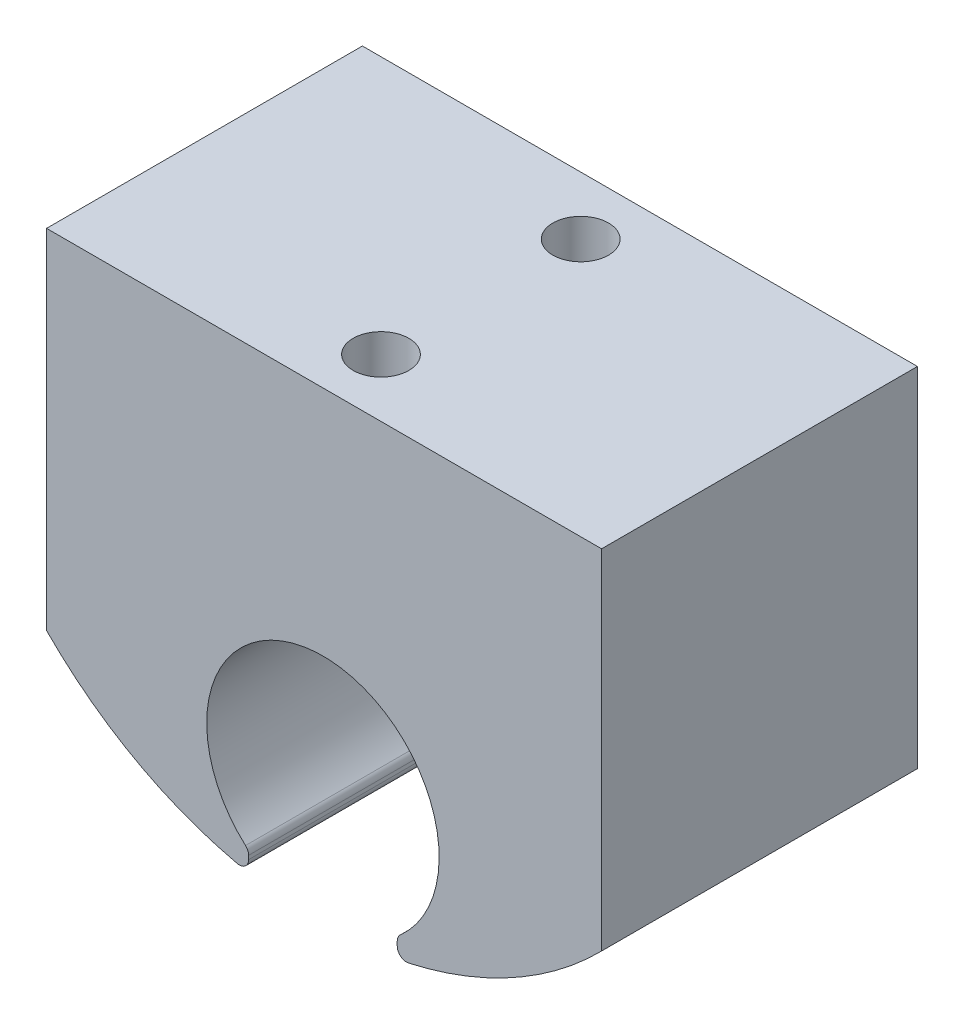
ISO-10303-21;
HEADER;
FILE_DESCRIPTION(('STEP AP214'),'2;1');
FILE_NAME('part.step','',(''),(''),'','','');
FILE_SCHEMA(('AUTOMOTIVE_DESIGN { 1 0 10303 214 1 1 1 1 }'));
ENDSEC;
DATA;
#1=APPLICATION_CONTEXT('core data for automotive mechanical design processes');
#2=APPLICATION_PROTOCOL_DEFINITION('international standard','automotive_design',2000,#1);
#3=PRODUCT_CONTEXT('',#1,'mechanical');
#4=PRODUCT('Part','Part','',(#3));
#5=PRODUCT_RELATED_PRODUCT_CATEGORY('part','',(#4));
#6=PRODUCT_DEFINITION_FORMATION('','',#4);
#7=PRODUCT_DEFINITION_CONTEXT('part definition',#1,'design');
#8=PRODUCT_DEFINITION('design','',#6,#7);
#9=PRODUCT_DEFINITION_SHAPE('','',#8);
#10=(LENGTH_UNIT() NAMED_UNIT(*) SI_UNIT(.MILLI.,.METRE.));
#11=(NAMED_UNIT(*) PLANE_ANGLE_UNIT() SI_UNIT($,.RADIAN.));
#12=(NAMED_UNIT(*) SI_UNIT($,.STERADIAN.) SOLID_ANGLE_UNIT());
#13=UNCERTAINTY_MEASURE_WITH_UNIT(LENGTH_MEASURE(1.E-05),#10,'distance_accuracy_value','');
#14=(GEOMETRIC_REPRESENTATION_CONTEXT(3) GLOBAL_UNCERTAINTY_ASSIGNED_CONTEXT((#13)) GLOBAL_UNIT_ASSIGNED_CONTEXT((#10,
#11,#12)) REPRESENTATION_CONTEXT('',''));
#15=CARTESIAN_POINT('',(0.,0.,0.));
#16=DIRECTION('',(0.,0.,1.));
#17=DIRECTION('',(1.,0.,0.));
#18=AXIS2_PLACEMENT_3D('',#15,#16,#17);
#19=CARTESIAN_POINT('',(-4.5,-5.24017537069862,-8.5));
#20=DIRECTION('',(0.,0.,1.));
#21=DIRECTION('',(1.,0.,0.));
#22=AXIS2_PLACEMENT_3D('',#19,#20,#21);
#23=CYLINDRICAL_SURFACE('',#22,0.5);
#24=DIRECTION('',(0.,0.,1.));
#25=VECTOR('',#24,1.);
#26=CARTESIAN_POINT('',(-4.,-5.24017537069862,-8.5));
#27=LINE('',#26,#25);
#28=CARTESIAN_POINT('',(-4.,-5.24017537069862,8.5));
#29=VERTEX_POINT('',#28);
#30=CARTESIAN_POINT('',(-4.,-5.24017537069862,-8.5));
#31=VERTEX_POINT('',#30);
#32=EDGE_CURVE('E234',#29,#31,#27,.F.);
#33=ORIENTED_EDGE('',*,*,#32,.F.);
#34=CARTESIAN_POINT('',(-4.5,-5.24017537069862,8.5));
#35=DIRECTION('',(0.,0.,1.));
#36=DIRECTION('',(1.,0.,0.));
#37=AXIS2_PLACEMENT_3D('',#34,#35,#36);
#38=CIRCLE('',#37,0.5);
#39=CARTESIAN_POINT('',(-4.61146008392665,-5.72759372251876,8.5));
#40=VERTEX_POINT('',#39);
#41=EDGE_CURVE('E41',#40,#29,#38,.T.);
#42=ORIENTED_EDGE('',*,*,#41,.F.);
#43=DIRECTION('',(0.,0.,1.));
#44=VECTOR('',#43,1.);
#45=CARTESIAN_POINT('',(-4.61146008392666,-5.72759372251876,-8.5));
#46=LINE('',#45,#44);
#47=CARTESIAN_POINT('',(-4.61146008392665,-5.72759372251876,-8.5));
#48=VERTEX_POINT('',#47);
#49=EDGE_CURVE('E231',#48,#40,#46,.T.);
#50=ORIENTED_EDGE('',*,*,#49,.F.);
#51=CARTESIAN_POINT('',(-4.5,-5.24017537069862,-8.5));
#52=DIRECTION('',(0.,0.,1.));
#53=DIRECTION('',(1.,0.,0.));
#54=AXIS2_PLACEMENT_3D('',#51,#52,#53);
#55=CIRCLE('',#54,0.5);
#56=EDGE_CURVE('E11',#31,#48,#55,.F.);
#57=ORIENTED_EDGE('',*,*,#56,.F.);
#58=EDGE_LOOP('',(#33,#42,#50,#57));
#59=FACE_BOUND('',#58,.T.);
#60=ADVANCED_FACE('F34',(#59),#23,.T.);
#61=CARTESIAN_POINT('',(-4.5,-5.03785916833728,-8.5));
#62=DIRECTION('',(0.,0.,1.));
#63=DIRECTION('',(1.,0.,0.));
#64=AXIS2_PLACEMENT_3D('',#61,#62,#63);
#65=CYLINDRICAL_SURFACE('',#64,0.5);
#66=DIRECTION('',(0.,0.,1.));
#67=VECTOR('',#66,1.);
#68=CARTESIAN_POINT('',(-4.16691339748335,-4.66496063626198,-8.5));
#69=LINE('',#68,#67);
#70=CARTESIAN_POINT('',(-4.16691339748335,-4.66496063626198,8.5));
#71=VERTEX_POINT('',#70);
#72=CARTESIAN_POINT('',(-4.16691339748335,-4.66496063626198,-8.5));
#73=VERTEX_POINT('',#72);
#74=EDGE_CURVE('E245',#71,#73,#69,.F.);
#75=ORIENTED_EDGE('',*,*,#74,.F.);
#76=CARTESIAN_POINT('',(-4.5,-5.03785916833728,8.5));
#77=DIRECTION('',(0.,0.,1.));
#78=DIRECTION('',(1.,0.,0.));
#79=AXIS2_PLACEMENT_3D('',#76,#77,#78);
#80=CIRCLE('',#79,0.5);
#81=CARTESIAN_POINT('',(-4.,-5.03785916833728,8.5));
#82=VERTEX_POINT('',#81);
#83=EDGE_CURVE('E244',#82,#71,#80,.T.);
#84=ORIENTED_EDGE('',*,*,#83,.F.);
#85=DIRECTION('',(0.,0.,1.));
#86=VECTOR('',#85,1.);
#87=CARTESIAN_POINT('',(-4.,-5.03785916833728,-8.5));
#88=LINE('',#87,#86);
#89=CARTESIAN_POINT('',(-4.,-5.03785916833728,-8.5));
#90=VERTEX_POINT('',#89);
#91=EDGE_CURVE('E242',#90,#82,#88,.T.);
#92=ORIENTED_EDGE('',*,*,#91,.F.);
#93=CARTESIAN_POINT('',(-4.5,-5.03785916833728,-8.5));
#94=DIRECTION('',(0.,0.,1.));
#95=DIRECTION('',(1.,0.,0.));
#96=AXIS2_PLACEMENT_3D('',#93,#94,#95);
#97=CIRCLE('',#96,0.5);
#98=EDGE_CURVE('E237',#73,#90,#97,.F.);
#99=ORIENTED_EDGE('',*,*,#98,.F.);
#100=EDGE_LOOP('',(#75,#84,#92,#99));
#101=FACE_BOUND('',#100,.T.);
#102=ADVANCED_FACE('F256',(#101),#65,.T.);
#103=CARTESIAN_POINT('',(4.5,-5.26810701066364,-8.5));
#104=DIRECTION('',(0.,0.,1.));
#105=DIRECTION('',(1.,0.,0.));
#106=AXIS2_PLACEMENT_3D('',#103,#104,#105);
#107=CYLINDRICAL_SURFACE('',#106,0.5);
#108=DIRECTION('',(0.,0.,-1.));
#109=VECTOR('',#108,1.);
#110=CARTESIAN_POINT('',(4.,-5.26810701066364,-8.5));
#111=LINE('',#110,#109);
#112=CARTESIAN_POINT('',(4.,-5.26810701066051,-8.5));
#113=VERTEX_POINT('',#112);
#114=CARTESIAN_POINT('',(4.,-5.26810701066051,8.5));
#115=VERTEX_POINT('',#114);
#116=EDGE_CURVE('E265',#113,#115,#111,.F.);
#117=ORIENTED_EDGE('',*,*,#116,.F.);
#118=CARTESIAN_POINT('',(4.5,-5.26810701066364,-8.5));
#119=DIRECTION('',(0.,0.,1.));
#120=DIRECTION('',(1.,0.,0.));
#121=AXIS2_PLACEMENT_3D('',#118,#119,#120);
#122=CIRCLE('',#121,0.5);
#123=CARTESIAN_POINT('',(4.60843254509282,-5.75620780267764,-8.5));
#124=VERTEX_POINT('',#123);
#125=EDGE_CURVE('E278',#124,#113,#122,.F.);
#126=ORIENTED_EDGE('',*,*,#125,.F.);
#127=DIRECTION('',(0.,0.,1.));
#128=VECTOR('',#127,1.);
#129=CARTESIAN_POINT('',(4.60843254509282,-5.75620780267764,-8.5));
#130=LINE('',#129,#128);
#131=CARTESIAN_POINT('',(4.60843254509282,-5.75620780267764,8.5));
#132=VERTEX_POINT('',#131);
#133=EDGE_CURVE('E276',#132,#124,#130,.F.);
#134=ORIENTED_EDGE('',*,*,#133,.F.);
#135=CARTESIAN_POINT('',(4.5,-5.26810701066364,8.5));
#136=DIRECTION('',(0.,0.,1.));
#137=DIRECTION('',(1.,0.,0.));
#138=AXIS2_PLACEMENT_3D('',#135,#136,#137);
#139=CIRCLE('',#138,0.5);
#140=EDGE_CURVE('E145',#115,#132,#139,.T.);
#141=ORIENTED_EDGE('',*,*,#140,.F.);
#142=EDGE_LOOP('',(#117,#126,#134,#141));
#143=FACE_BOUND('',#142,.T.);
#144=ADVANCED_FACE('F281',(#143),#107,.T.);
#145=CARTESIAN_POINT('',(4.5,-5.03785916833728,-8.5));
#146=DIRECTION('',(0.,0.,1.));
#147=DIRECTION('',(1.,0.,0.));
#148=AXIS2_PLACEMENT_3D('',#145,#146,#147);
#149=CYLINDRICAL_SURFACE('',#148,0.5);
#150=DIRECTION('',(0.,0.,1.));
#151=VECTOR('',#150,1.);
#152=CARTESIAN_POINT('',(4.16691339748335,-4.66496063626198,-8.5));
#153=LINE('',#152,#151);
#154=CARTESIAN_POINT('',(4.16691339748334,-4.66496063626198,-8.5));
#155=VERTEX_POINT('',#154);
#156=CARTESIAN_POINT('',(4.16691339748334,-4.66496063626198,8.5));
#157=VERTEX_POINT('',#156);
#158=EDGE_CURVE('E184',#155,#157,#153,.T.);
#159=ORIENTED_EDGE('',*,*,#158,.F.);
#160=CARTESIAN_POINT('',(4.5,-5.03785916833728,-8.5));
#161=DIRECTION('',(0.,0.,1.));
#162=DIRECTION('',(1.,0.,0.));
#163=AXIS2_PLACEMENT_3D('',#160,#161,#162);
#164=CIRCLE('',#163,0.5);
#165=CARTESIAN_POINT('',(4.,-5.03785916833728,-8.5));
#166=VERTEX_POINT('',#165);
#167=EDGE_CURVE('E266',#166,#155,#164,.F.);
#168=ORIENTED_EDGE('',*,*,#167,.F.);
#169=DIRECTION('',(0.,0.,-1.));
#170=VECTOR('',#169,1.);
#171=CARTESIAN_POINT('',(4.,-5.03785916833728,-8.5));
#172=LINE('',#171,#170);
#173=CARTESIAN_POINT('',(4.,-5.03785916833728,8.5));
#174=VERTEX_POINT('',#173);
#175=EDGE_CURVE('E187',#174,#166,#172,.T.);
#176=ORIENTED_EDGE('',*,*,#175,.F.);
#177=CARTESIAN_POINT('',(4.5,-5.03785916833728,8.5));
#178=DIRECTION('',(0.,0.,1.));
#179=DIRECTION('',(1.,0.,0.));
#180=AXIS2_PLACEMENT_3D('',#177,#178,#179);
#181=CIRCLE('',#180,0.5);
#182=EDGE_CURVE('E261',#157,#174,#181,.T.);
#183=ORIENTED_EDGE('',*,*,#182,.F.);
#184=EDGE_LOOP('',(#159,#168,#176,#183));
#185=FACE_BOUND('',#184,.T.);
#186=ADVANCED_FACE('F269',(#185),#149,.T.);
#187=CARTESIAN_POINT('',(0.0619571688829715,14.7094026844744,-8.5));
#188=DIRECTION('',(0.,0.,1.));
#189=DIRECTION('',(1.,0.,0.));
#190=AXIS2_PLACEMENT_3D('',#187,#188,#189);
#191=CYLINDRICAL_SURFACE('',#190,20.9645331681464);
#192=CARTESIAN_POINT('',(0.0619571688829715,14.7094026844744,8.5));
#193=DIRECTION('',(0.,0.,1.));
#194=DIRECTION('',(1.,0.,0.));
#195=AXIS2_PLACEMENT_3D('',#192,#193,#194);
#196=CIRCLE('',#195,20.9645331681464);
#197=CARTESIAN_POINT('',(15.,0.,8.5));
#198=VERTEX_POINT('',#197);
#199=EDGE_CURVE('E124',#198,#132,#196,.F.);
#200=ORIENTED_EDGE('',*,*,#199,.T.);
#201=ORIENTED_EDGE('',*,*,#133,.T.);
#202=CARTESIAN_POINT('',(0.0619571688829715,14.7094026844744,-8.5));
#203=DIRECTION('',(0.,0.,1.));
#204=DIRECTION('',(1.,0.,0.));
#205=AXIS2_PLACEMENT_3D('',#202,#203,#204);
#206=CIRCLE('',#205,20.9645331681464);
#207=CARTESIAN_POINT('',(15.,0.,-8.5));
#208=VERTEX_POINT('',#207);
#209=EDGE_CURVE('E126',#208,#124,#206,.F.);
#210=ORIENTED_EDGE('',*,*,#209,.F.);
#211=DIRECTION('',(0.,0.,1.));
#212=VECTOR('',#211,1.);
#213=CARTESIAN_POINT('',(15.,0.,-8.5));
#214=LINE('',#213,#212);
#215=EDGE_CURVE('E119',#208,#198,#214,.T.);
#216=ORIENTED_EDGE('',*,*,#215,.T.);
#217=EDGE_LOOP('',(#200,#201,#210,#216));
#218=FACE_BOUND('',#217,.T.);
#219=ADVANCED_FACE('F121',(#218),#191,.T.);
#220=CARTESIAN_POINT('',(0.,0.,-8.5));
#221=DIRECTION('',(0.,0.,1.));
#222=DIRECTION('',(1.,0.,0.));
#223=AXIS2_PLACEMENT_3D('',#220,#221,#222);
#224=CYLINDRICAL_SURFACE('',#223,6.255);
#225=CARTESIAN_POINT('',(0.,0.,8.5));
#226=DIRECTION('',(0.,0.,1.));
#227=DIRECTION('',(1.,0.,0.));
#228=AXIS2_PLACEMENT_3D('',#225,#226,#227);
#229=CIRCLE('',#228,6.255);
#230=EDGE_CURVE('E159',#157,#71,#229,.T.);
#231=ORIENTED_EDGE('',*,*,#230,.T.);
#232=ORIENTED_EDGE('',*,*,#74,.T.);
#233=CARTESIAN_POINT('',(0.,0.,-8.5));
#234=DIRECTION('',(0.,0.,1.));
#235=DIRECTION('',(1.,0.,0.));
#236=AXIS2_PLACEMENT_3D('',#233,#234,#235);
#237=CIRCLE('',#236,6.255);
#238=EDGE_CURVE('E131',#155,#73,#237,.T.);
#239=ORIENTED_EDGE('',*,*,#238,.F.);
#240=ORIENTED_EDGE('',*,*,#158,.T.);
#241=EDGE_LOOP('',(#231,#232,#239,#240));
#242=FACE_BOUND('',#241,.T.);
#243=ADVANCED_FACE('F258',(#242),#224,.F.);
#244=CARTESIAN_POINT('',(0.,0.,-8.5));
#245=DIRECTION('',(0.,0.,1.));
#246=DIRECTION('',(1.,0.,0.));
#247=AXIS2_PLACEMENT_3D('',#244,#245,#246);
#248=PLANE('',#247);
#249=DIRECTION('',(0.,-1.,0.));
#250=VECTOR('',#249,1.);
#251=CARTESIAN_POINT('',(-4.,0.,-8.5));
#252=LINE('',#251,#250);
#253=EDGE_CURVE('E147',#90,#31,#252,.T.);
#254=ORIENTED_EDGE('',*,*,#253,.T.);
#255=ORIENTED_EDGE('',*,*,#56,.T.);
#256=CARTESIAN_POINT('',(0.0619571688829715,14.7094026844744,-8.5));
#257=DIRECTION('',(0.,0.,1.));
#258=DIRECTION('',(1.,0.,0.));
#259=AXIS2_PLACEMENT_3D('',#256,#257,#258);
#260=CIRCLE('',#259,20.9645331681464);
#261=CARTESIAN_POINT('',(-14.8760856622341,0.,-8.5));
#262=VERTEX_POINT('',#261);
#263=EDGE_CURVE('E169',#48,#262,#260,.F.);
#264=ORIENTED_EDGE('',*,*,#263,.T.);
#265=DIRECTION('',(0.,1.,0.));
#266=VECTOR('',#265,1.);
#267=CARTESIAN_POINT('',(-14.8760856622341,0.,-8.5));
#268=LINE('',#267,#266);
#269=CARTESIAN_POINT('',(-14.8760856622341,18.75,-8.5));
#270=VERTEX_POINT('',#269);
#271=EDGE_CURVE('E167',#262,#270,#268,.T.);
#272=ORIENTED_EDGE('',*,*,#271,.T.);
#273=DIRECTION('',(1.,0.,0.));
#274=VECTOR('',#273,1.);
#275=CARTESIAN_POINT('',(0.,18.75,-8.5));
#276=LINE('',#275,#274);
#277=CARTESIAN_POINT('',(15.,18.75,-8.5));
#278=VERTEX_POINT('',#277);
#279=EDGE_CURVE('E165',#270,#278,#276,.T.);
#280=ORIENTED_EDGE('',*,*,#279,.T.);
#281=DIRECTION('',(0.,1.,0.));
#282=VECTOR('',#281,1.);
#283=CARTESIAN_POINT('',(15.,0.,-8.5));
#284=LINE('',#283,#282);
#285=EDGE_CURVE('E163',#208,#278,#284,.T.);
#286=ORIENTED_EDGE('',*,*,#285,.F.);
#287=ORIENTED_EDGE('',*,*,#209,.T.);
#288=ORIENTED_EDGE('',*,*,#125,.T.);
#289=DIRECTION('',(0.,-1.,0.));
#290=VECTOR('',#289,1.);
#291=CARTESIAN_POINT('',(4.,0.,-8.5));
#292=LINE('',#291,#290);
#293=EDGE_CURVE('E149',#166,#113,#292,.T.);
#294=ORIENTED_EDGE('',*,*,#293,.F.);
#295=ORIENTED_EDGE('',*,*,#167,.T.);
#296=ORIENTED_EDGE('',*,*,#238,.T.);
#297=ORIENTED_EDGE('',*,*,#98,.T.);
#298=EDGE_LOOP('',(#254,#255,#264,#272,#280,#286,#287,#288,#294,#295,#296,#297));
#299=FACE_BOUND('',#298,.T.);
#300=ADVANCED_FACE('F253',(#299),#248,.F.);
#301=CARTESIAN_POINT('',(0.,0.,8.5));
#302=DIRECTION('',(0.,0.,1.));
#303=DIRECTION('',(1.,0.,0.));
#304=AXIS2_PLACEMENT_3D('',#301,#302,#303);
#305=PLANE('',#304);
#306=CARTESIAN_POINT('',(0.0619571688829715,14.7094026844744,8.5));
#307=DIRECTION('',(0.,0.,1.));
#308=DIRECTION('',(1.,0.,0.));
#309=AXIS2_PLACEMENT_3D('',#306,#307,#308);
#310=CIRCLE('',#309,20.9645331681464);
#311=CARTESIAN_POINT('',(-14.8760856622341,0.,8.5));
#312=VERTEX_POINT('',#311);
#313=EDGE_CURVE('E157',#40,#312,#310,.F.);
#314=ORIENTED_EDGE('',*,*,#313,.F.);
#315=ORIENTED_EDGE('',*,*,#41,.T.);
#316=DIRECTION('',(0.,-1.,0.));
#317=VECTOR('',#316,1.);
#318=CARTESIAN_POINT('',(-4.,0.,8.5));
#319=LINE('',#318,#317);
#320=EDGE_CURVE('E176',#82,#29,#319,.T.);
#321=ORIENTED_EDGE('',*,*,#320,.F.);
#322=ORIENTED_EDGE('',*,*,#83,.T.);
#323=ORIENTED_EDGE('',*,*,#230,.F.);
#324=ORIENTED_EDGE('',*,*,#182,.T.);
#325=DIRECTION('',(0.,-1.,0.));
#326=VECTOR('',#325,1.);
#327=CARTESIAN_POINT('',(4.,0.,8.5));
#328=LINE('',#327,#326);
#329=EDGE_CURVE('E182',#174,#115,#328,.T.);
#330=ORIENTED_EDGE('',*,*,#329,.T.);
#331=ORIENTED_EDGE('',*,*,#140,.T.);
#332=ORIENTED_EDGE('',*,*,#199,.F.);
#333=DIRECTION('',(0.,1.,0.));
#334=VECTOR('',#333,1.);
#335=CARTESIAN_POINT('',(15.,0.,8.5));
#336=LINE('',#335,#334);
#337=CARTESIAN_POINT('',(15.,18.75,8.5));
#338=VERTEX_POINT('',#337);
#339=EDGE_CURVE('E134',#198,#338,#336,.T.);
#340=ORIENTED_EDGE('',*,*,#339,.T.);
#341=DIRECTION('',(1.,0.,0.));
#342=VECTOR('',#341,1.);
#343=CARTESIAN_POINT('',(0.,18.75,8.5));
#344=LINE('',#343,#342);
#345=CARTESIAN_POINT('',(-14.8760856622341,18.75,8.5));
#346=VERTEX_POINT('',#345);
#347=EDGE_CURVE('E140',#346,#338,#344,.T.);
#348=ORIENTED_EDGE('',*,*,#347,.F.);
#349=DIRECTION('',(0.,1.,0.));
#350=VECTOR('',#349,1.);
#351=CARTESIAN_POINT('',(-14.8760856622341,0.,8.5));
#352=LINE('',#351,#350);
#353=EDGE_CURVE('E154',#312,#346,#352,.T.);
#354=ORIENTED_EDGE('',*,*,#353,.F.);
#355=EDGE_LOOP('',(#314,#315,#321,#322,#323,#324,#330,#331,#332,#340,#348,#354));
#356=FACE_BOUND('',#355,.T.);
#357=ADVANCED_FACE('F143',(#356),#305,.T.);
#358=CARTESIAN_POINT('',(0.0619571688829715,14.7094026844744,-8.5));
#359=DIRECTION('',(0.,0.,1.));
#360=DIRECTION('',(1.,0.,0.));
#361=AXIS2_PLACEMENT_3D('',#358,#359,#360);
#362=CYLINDRICAL_SURFACE('',#361,20.9645331681464);
#363=ORIENTED_EDGE('',*,*,#263,.F.);
#364=ORIENTED_EDGE('',*,*,#49,.T.);
#365=ORIENTED_EDGE('',*,*,#313,.T.);
#366=DIRECTION('',(0.,0.,1.));
#367=VECTOR('',#366,1.);
#368=CARTESIAN_POINT('',(-14.8760856622341,0.,-8.5));
#369=LINE('',#368,#367);
#370=EDGE_CURVE('E173',#262,#312,#369,.T.);
#371=ORIENTED_EDGE('',*,*,#370,.F.);
#372=EDGE_LOOP('',(#363,#364,#365,#371));
#373=FACE_BOUND('',#372,.T.);
#374=ADVANCED_FACE('F230',(#373),#362,.T.);
#375=CARTESIAN_POINT('',(-14.8760856622341,0.,-8.5));
#376=DIRECTION('',(1.,0.,0.));
#377=DIRECTION('',(0.,0.,-1.));
#378=AXIS2_PLACEMENT_3D('',#375,#376,#377);
#379=PLANE('',#378);
#380=ORIENTED_EDGE('',*,*,#370,.T.);
#381=ORIENTED_EDGE('',*,*,#353,.T.);
#382=DIRECTION('',(0.,0.,1.));
#383=VECTOR('',#382,1.);
#384=CARTESIAN_POINT('',(-14.8760856622341,18.75,-8.5));
#385=LINE('',#384,#383);
#386=EDGE_CURVE('E177',#270,#346,#385,.T.);
#387=ORIENTED_EDGE('',*,*,#386,.F.);
#388=ORIENTED_EDGE('',*,*,#271,.F.);
#389=EDGE_LOOP('',(#380,#381,#387,#388));
#390=FACE_BOUND('',#389,.T.);
#391=ADVANCED_FACE('F218',(#390),#379,.F.);
#392=CARTESIAN_POINT('',(0.,18.75,-8.5));
#393=DIRECTION('',(0.,-1.,0.));
#394=DIRECTION('',(0.,0.,-1.));
#395=AXIS2_PLACEMENT_3D('',#392,#393,#394);
#396=PLANE('',#395);
#397=CARTESIAN_POINT('',(0.,18.75,5.375));
#398=DIRECTION('',(0.,1.,0.));
#399=DIRECTION('',(0.,0.,1.));
#400=AXIS2_PLACEMENT_3D('',#397,#398,#399);
#401=CIRCLE('',#400,1.5);
#402=CARTESIAN_POINT('',(0.,18.75,6.875));
#403=VERTEX_POINT('',#402);
#404=EDGE_CURVE('E200',#403,#403,#401,.T.);
#405=ORIENTED_EDGE('',*,*,#404,.F.);
#406=EDGE_LOOP('',(#405));
#407=FACE_BOUND('',#406,.T.);
#408=CARTESIAN_POINT('',(0.,18.75,-5.375));
#409=DIRECTION('',(0.,1.,0.));
#410=DIRECTION('',(0.,0.,1.));
#411=AXIS2_PLACEMENT_3D('',#408,#409,#410);
#412=CIRCLE('',#411,1.5);
#413=CARTESIAN_POINT('',(0.,18.75,-3.875));
#414=VERTEX_POINT('',#413);
#415=EDGE_CURVE('E197',#414,#414,#412,.T.);
#416=ORIENTED_EDGE('',*,*,#415,.F.);
#417=EDGE_LOOP('',(#416));
#418=FACE_BOUND('',#417,.T.);
#419=ORIENTED_EDGE('',*,*,#386,.T.);
#420=ORIENTED_EDGE('',*,*,#347,.T.);
#421=DIRECTION('',(0.,0.,1.));
#422=VECTOR('',#421,1.);
#423=CARTESIAN_POINT('',(15.,18.75,-8.5));
#424=LINE('',#423,#422);
#425=EDGE_CURVE('E130',#278,#338,#424,.T.);
#426=ORIENTED_EDGE('',*,*,#425,.F.);
#427=ORIENTED_EDGE('',*,*,#279,.F.);
#428=EDGE_LOOP('',(#419,#420,#426,#427));
#429=FACE_BOUND('',#428,.T.);
#430=ADVANCED_FACE('F215',(#407,#418,#429),#396,.F.);
#431=CARTESIAN_POINT('',(15.,0.,-8.5));
#432=DIRECTION('',(1.,0.,0.));
#433=DIRECTION('',(0.,0.,-1.));
#434=AXIS2_PLACEMENT_3D('',#431,#432,#433);
#435=PLANE('',#434);
#436=ORIENTED_EDGE('',*,*,#425,.T.);
#437=ORIENTED_EDGE('',*,*,#339,.F.);
#438=ORIENTED_EDGE('',*,*,#215,.F.);
#439=ORIENTED_EDGE('',*,*,#285,.T.);
#440=EDGE_LOOP('',(#436,#437,#438,#439));
#441=FACE_BOUND('',#440,.T.);
#442=ADVANCED_FACE('F135',(#441),#435,.T.);
#443=CARTESIAN_POINT('',(-4.,0.,-8.5));
#444=DIRECTION('',(-1.,0.,0.));
#445=DIRECTION('',(0.,-1.,0.));
#446=AXIS2_PLACEMENT_3D('',#443,#444,#445);
#447=PLANE('',#446);
#448=ORIENTED_EDGE('',*,*,#320,.T.);
#449=ORIENTED_EDGE('',*,*,#32,.T.);
#450=ORIENTED_EDGE('',*,*,#253,.F.);
#451=ORIENTED_EDGE('',*,*,#91,.T.);
#452=EDGE_LOOP('',(#448,#449,#450,#451));
#453=FACE_BOUND('',#452,.T.);
#454=ADVANCED_FACE('F240',(#453),#447,.F.);
#455=CARTESIAN_POINT('',(4.,0.,-8.5));
#456=DIRECTION('',(-1.,0.,0.));
#457=DIRECTION('',(0.,-1.,0.));
#458=AXIS2_PLACEMENT_3D('',#455,#456,#457);
#459=PLANE('',#458);
#460=ORIENTED_EDGE('',*,*,#293,.T.);
#461=ORIENTED_EDGE('',*,*,#116,.T.);
#462=ORIENTED_EDGE('',*,*,#329,.F.);
#463=ORIENTED_EDGE('',*,*,#175,.T.);
#464=EDGE_LOOP('',(#460,#461,#462,#463));
#465=FACE_BOUND('',#464,.T.);
#466=ADVANCED_FACE('F273',(#465),#459,.T.);
#467=CARTESIAN_POINT('',(0.,13.75,-5.375));
#468=DIRECTION('',(0.,1.,0.));
#469=DIRECTION('',(0.,0.,1.));
#470=AXIS2_PLACEMENT_3D('',#467,#468,#469);
#471=CYLINDRICAL_SURFACE('',#470,1.5);
#472=CARTESIAN_POINT('',(0.,13.75,-5.375));
#473=DIRECTION('',(0.,1.,0.));
#474=DIRECTION('',(0.,0.,1.));
#475=AXIS2_PLACEMENT_3D('',#472,#473,#474);
#476=CIRCLE('',#475,1.5);
#477=CARTESIAN_POINT('',(0.,13.75,-3.875));
#478=VERTEX_POINT('',#477);
#479=EDGE_CURVE('E194',#478,#478,#476,.T.);
#480=ORIENTED_EDGE('',*,*,#479,.F.);
#481=EDGE_LOOP('',(#480));
#482=FACE_BOUND('',#481,.T.);
#483=ORIENTED_EDGE('',*,*,#415,.T.);
#484=EDGE_LOOP('',(#483));
#485=FACE_BOUND('',#484,.T.);
#486=ADVANCED_FACE('F361',(#482,#485),#471,.F.);
#487=CARTESIAN_POINT('',(0.,13.75,-5.375));
#488=DIRECTION('',(0.,1.,0.));
#489=DIRECTION('',(0.,0.,1.));
#490=AXIS2_PLACEMENT_3D('',#487,#488,#489);
#491=PLANE('',#490);
#492=ORIENTED_EDGE('',*,*,#479,.T.);
#493=EDGE_LOOP('',(#492));
#494=FACE_BOUND('',#493,.T.);
#495=ADVANCED_FACE('F211',(#494),#491,.T.);
#496=CARTESIAN_POINT('',(0.,13.75,5.375));
#497=DIRECTION('',(0.,1.,0.));
#498=DIRECTION('',(0.,0.,1.));
#499=AXIS2_PLACEMENT_3D('',#496,#497,#498);
#500=CYLINDRICAL_SURFACE('',#499,1.5);
#501=CARTESIAN_POINT('',(0.,13.75,5.375));
#502=DIRECTION('',(0.,1.,0.));
#503=DIRECTION('',(0.,0.,1.));
#504=AXIS2_PLACEMENT_3D('',#501,#502,#503);
#505=CIRCLE('',#504,1.5);
#506=CARTESIAN_POINT('',(0.,13.75,6.875));
#507=VERTEX_POINT('',#506);
#508=EDGE_CURVE('E190',#507,#507,#505,.T.);
#509=ORIENTED_EDGE('',*,*,#508,.F.);
#510=EDGE_LOOP('',(#509));
#511=FACE_BOUND('',#510,.T.);
#512=ORIENTED_EDGE('',*,*,#404,.T.);
#513=EDGE_LOOP('',(#512));
#514=FACE_BOUND('',#513,.T.);
#515=ADVANCED_FACE('F208',(#511,#514),#500,.F.);
#516=CARTESIAN_POINT('',(0.,13.75,5.375));
#517=DIRECTION('',(0.,1.,0.));
#518=DIRECTION('',(0.,0.,1.));
#519=AXIS2_PLACEMENT_3D('',#516,#517,#518);
#520=PLANE('',#519);
#521=ORIENTED_EDGE('',*,*,#508,.T.);
#522=EDGE_LOOP('',(#521));
#523=FACE_BOUND('',#522,.T.);
#524=ADVANCED_FACE('F206',(#523),#520,.T.);
#525=CLOSED_SHELL('',(#60,#102,#144,#186,#219,#243,#300,#357,#374,#391,#430,#442,#454,#466,#486,
#495,#515,#524));
#526=MANIFOLD_SOLID_BREP('B2',#525);
#527=ADVANCED_BREP_SHAPE_REPRESENTATION('',(#18,#526),#14);
#528=SHAPE_DEFINITION_REPRESENTATION(#9,#527);
ENDSEC;
END-ISO-10303-21;
